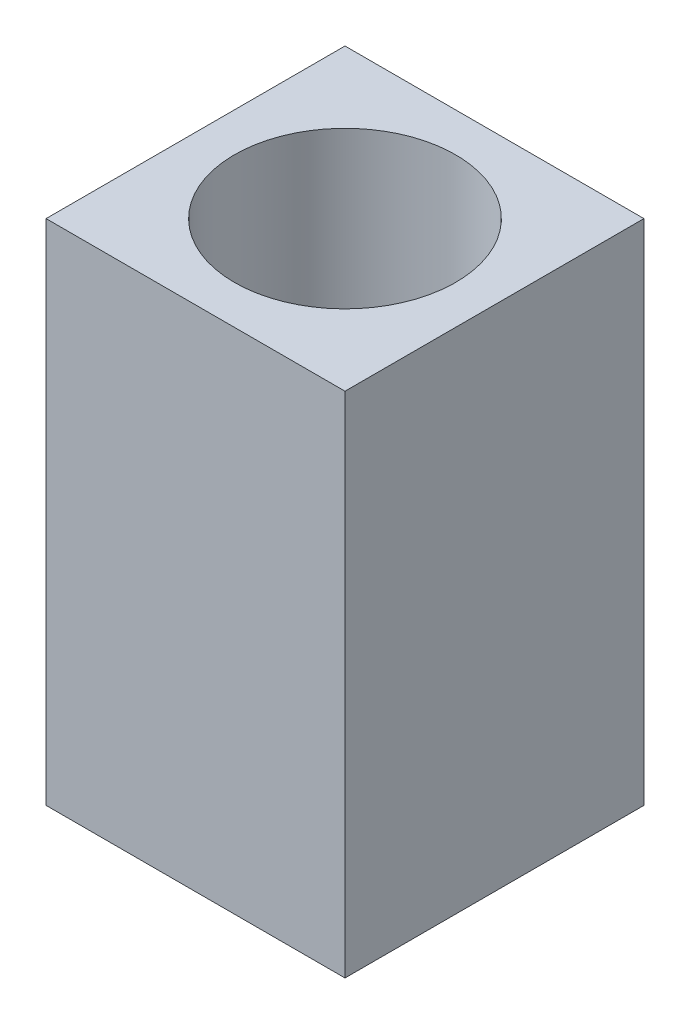
ISO-10303-21;
HEADER;
FILE_DESCRIPTION(('STEP AP214'),'2;1');
FILE_NAME('part.step','',(''),(''),'','','');
FILE_SCHEMA(('AUTOMOTIVE_DESIGN { 1 0 10303 214 1 1 1 1 }'));
ENDSEC;
DATA;
#1=APPLICATION_CONTEXT('core data for automotive mechanical design processes');
#2=APPLICATION_PROTOCOL_DEFINITION('international standard','automotive_design',2000,#1);
#3=PRODUCT_CONTEXT('',#1,'mechanical');
#4=PRODUCT('Part','Part','',(#3));
#5=PRODUCT_RELATED_PRODUCT_CATEGORY('part','',(#4));
#6=PRODUCT_DEFINITION_FORMATION('','',#4);
#7=PRODUCT_DEFINITION_CONTEXT('part definition',#1,'design');
#8=PRODUCT_DEFINITION('design','',#6,#7);
#9=PRODUCT_DEFINITION_SHAPE('','',#8);
#10=(LENGTH_UNIT() NAMED_UNIT(*) SI_UNIT(.MILLI.,.METRE.));
#11=(NAMED_UNIT(*) PLANE_ANGLE_UNIT() SI_UNIT($,.RADIAN.));
#12=(NAMED_UNIT(*) SI_UNIT($,.STERADIAN.) SOLID_ANGLE_UNIT());
#13=UNCERTAINTY_MEASURE_WITH_UNIT(LENGTH_MEASURE(1.E-05),#10,'distance_accuracy_value','');
#14=(GEOMETRIC_REPRESENTATION_CONTEXT(3) GLOBAL_UNCERTAINTY_ASSIGNED_CONTEXT((#13)) GLOBAL_UNIT_ASSIGNED_CONTEXT((#10,
#11,#12)) REPRESENTATION_CONTEXT('',''));
#15=CARTESIAN_POINT('',(0.,0.,0.));
#16=DIRECTION('',(0.,0.,1.));
#17=DIRECTION('',(1.,0.,0.));
#18=AXIS2_PLACEMENT_3D('',#15,#16,#17);
#19=CARTESIAN_POINT('',(0.,17.,0.));
#20=DIRECTION('',(0.,0.,-1.));
#21=DIRECTION('',(-1.,0.,0.));
#22=AXIS2_PLACEMENT_3D('',#19,#20,#21);
#23=PLANE('',#22);
#24=DIRECTION('',(1.,0.,0.));
#25=VECTOR('',#24,1.);
#26=CARTESIAN_POINT('',(0.,0.,0.));
#27=LINE('',#26,#25);
#28=CARTESIAN_POINT('',(0.,0.,0.));
#29=VERTEX_POINT('',#28);
#30=CARTESIAN_POINT('',(10.,0.,0.));
#31=VERTEX_POINT('',#30);
#32=EDGE_CURVE('E100',#29,#31,#27,.T.);
#33=ORIENTED_EDGE('',*,*,#32,.T.);
#34=DIRECTION('',(0.,-1.,0.));
#35=VECTOR('',#34,1.);
#36=CARTESIAN_POINT('',(10.,17.,0.));
#37=LINE('',#36,#35);
#38=CARTESIAN_POINT('',(10.,17.,0.));
#39=VERTEX_POINT('',#38);
#40=EDGE_CURVE('E11',#39,#31,#37,.T.);
#41=ORIENTED_EDGE('',*,*,#40,.F.);
#42=DIRECTION('',(1.,0.,0.));
#43=VECTOR('',#42,1.);
#44=CARTESIAN_POINT('',(0.,17.,0.));
#45=LINE('',#44,#43);
#46=CARTESIAN_POINT('',(0.,17.,0.));
#47=VERTEX_POINT('',#46);
#48=EDGE_CURVE('E88',#47,#39,#45,.T.);
#49=ORIENTED_EDGE('',*,*,#48,.F.);
#50=DIRECTION('',(0.,-1.,0.));
#51=VECTOR('',#50,1.);
#52=CARTESIAN_POINT('',(0.,17.,0.));
#53=LINE('',#52,#51);
#54=EDGE_CURVE('E96',#47,#29,#53,.T.);
#55=ORIENTED_EDGE('',*,*,#54,.T.);
#56=EDGE_LOOP('',(#33,#41,#49,#55));
#57=FACE_BOUND('',#56,.T.);
#58=ADVANCED_FACE('F37',(#57),#23,.F.);
#59=CARTESIAN_POINT('',(10.,17.,0.));
#60=DIRECTION('',(-1.,0.,0.));
#61=DIRECTION('',(0.,0.,1.));
#62=AXIS2_PLACEMENT_3D('',#59,#60,#61);
#63=PLANE('',#62);
#64=DIRECTION('',(0.,0.,-1.));
#65=VECTOR('',#64,1.);
#66=CARTESIAN_POINT('',(10.,0.,0.));
#67=LINE('',#66,#65);
#68=CARTESIAN_POINT('',(10.,0.,-10.));
#69=VERTEX_POINT('',#68);
#70=EDGE_CURVE('E92',#31,#69,#67,.T.);
#71=ORIENTED_EDGE('',*,*,#70,.T.);
#72=DIRECTION('',(0.,-1.,0.));
#73=VECTOR('',#72,1.);
#74=CARTESIAN_POINT('',(10.,17.,-10.));
#75=LINE('',#74,#73);
#76=CARTESIAN_POINT('',(10.,17.,-10.));
#77=VERTEX_POINT('',#76);
#78=EDGE_CURVE('E45',#77,#69,#75,.T.);
#79=ORIENTED_EDGE('',*,*,#78,.F.);
#80=DIRECTION('',(0.,0.,-1.));
#81=VECTOR('',#80,1.);
#82=CARTESIAN_POINT('',(10.,17.,0.));
#83=LINE('',#82,#81);
#84=EDGE_CURVE('E83',#39,#77,#83,.T.);
#85=ORIENTED_EDGE('',*,*,#84,.F.);
#86=ORIENTED_EDGE('',*,*,#40,.T.);
#87=EDGE_LOOP('',(#71,#79,#85,#86));
#88=FACE_BOUND('',#87,.T.);
#89=ADVANCED_FACE('F91',(#88),#63,.F.);
#90=CARTESIAN_POINT('',(0.,17.,-10.));
#91=DIRECTION('',(0.,0.,1.));
#92=DIRECTION('',(1.,0.,0.));
#93=AXIS2_PLACEMENT_3D('',#90,#91,#92);
#94=PLANE('',#93);
#95=DIRECTION('',(-1.,0.,0.));
#96=VECTOR('',#95,1.);
#97=CARTESIAN_POINT('',(0.,0.,-10.));
#98=LINE('',#97,#96);
#99=CARTESIAN_POINT('',(0.,0.,-10.));
#100=VERTEX_POINT('',#99);
#101=EDGE_CURVE('E70',#69,#100,#98,.T.);
#102=ORIENTED_EDGE('',*,*,#101,.T.);
#103=DIRECTION('',(0.,-1.,0.));
#104=VECTOR('',#103,1.);
#105=CARTESIAN_POINT('',(0.,17.,-10.));
#106=LINE('',#105,#104);
#107=CARTESIAN_POINT('',(0.,17.,-10.));
#108=VERTEX_POINT('',#107);
#109=EDGE_CURVE('E93',#108,#100,#106,.T.);
#110=ORIENTED_EDGE('',*,*,#109,.F.);
#111=DIRECTION('',(-1.,0.,0.));
#112=VECTOR('',#111,1.);
#113=CARTESIAN_POINT('',(0.,17.,-10.));
#114=LINE('',#113,#112);
#115=EDGE_CURVE('E86',#77,#108,#114,.T.);
#116=ORIENTED_EDGE('',*,*,#115,.F.);
#117=ORIENTED_EDGE('',*,*,#78,.T.);
#118=EDGE_LOOP('',(#102,#110,#116,#117));
#119=FACE_BOUND('',#118,.T.);
#120=ADVANCED_FACE('F94',(#119),#94,.F.);
#121=CARTESIAN_POINT('',(0.,17.,0.));
#122=DIRECTION('',(1.,0.,0.));
#123=DIRECTION('',(0.,0.,-1.));
#124=AXIS2_PLACEMENT_3D('',#121,#122,#123);
#125=PLANE('',#124);
#126=DIRECTION('',(0.,0.,1.));
#127=VECTOR('',#126,1.);
#128=CARTESIAN_POINT('',(0.,0.,0.));
#129=LINE('',#128,#127);
#130=EDGE_CURVE('E76',#100,#29,#129,.T.);
#131=ORIENTED_EDGE('',*,*,#130,.T.);
#132=ORIENTED_EDGE('',*,*,#54,.F.);
#133=DIRECTION('',(0.,0.,1.));
#134=VECTOR('',#133,1.);
#135=CARTESIAN_POINT('',(0.,17.,0.));
#136=LINE('',#135,#134);
#137=EDGE_CURVE('E53',#108,#47,#136,.T.);
#138=ORIENTED_EDGE('',*,*,#137,.F.);
#139=ORIENTED_EDGE('',*,*,#109,.T.);
#140=EDGE_LOOP('',(#131,#132,#138,#139));
#141=FACE_BOUND('',#140,.T.);
#142=ADVANCED_FACE('F108',(#141),#125,.F.);
#143=CARTESIAN_POINT('',(0.,17.,0.));
#144=DIRECTION('',(0.,1.,0.));
#145=DIRECTION('',(0.,0.,1.));
#146=AXIS2_PLACEMENT_3D('',#143,#144,#145);
#147=PLANE('',#146);
#148=CARTESIAN_POINT('',(5.,17.,-5.));
#149=DIRECTION('',(0.,1.,0.));
#150=DIRECTION('',(0.,0.,1.));
#151=AXIS2_PLACEMENT_3D('',#148,#149,#150);
#152=CIRCLE('',#151,3.7);
#153=CARTESIAN_POINT('',(5.,17.,-1.3));
#154=VERTEX_POINT('',#153);
#155=EDGE_CURVE('E114',#154,#154,#152,.T.);
#156=ORIENTED_EDGE('',*,*,#155,.F.);
#157=EDGE_LOOP('',(#156));
#158=FACE_BOUND('',#157,.T.);
#159=ORIENTED_EDGE('',*,*,#48,.T.);
#160=ORIENTED_EDGE('',*,*,#84,.T.);
#161=ORIENTED_EDGE('',*,*,#115,.T.);
#162=ORIENTED_EDGE('',*,*,#137,.T.);
#163=EDGE_LOOP('',(#159,#160,#161,#162));
#164=FACE_BOUND('',#163,.T.);
#165=ADVANCED_FACE('F84',(#158,#164),#147,.T.);
#166=CARTESIAN_POINT('',(0.,0.,0.));
#167=DIRECTION('',(0.,1.,0.));
#168=DIRECTION('',(0.,0.,1.));
#169=AXIS2_PLACEMENT_3D('',#166,#167,#168);
#170=PLANE('',#169);
#171=CARTESIAN_POINT('',(5.,0.,-5.));
#172=DIRECTION('',(0.,1.,0.));
#173=DIRECTION('',(0.,0.,1.));
#174=AXIS2_PLACEMENT_3D('',#171,#172,#173);
#175=CIRCLE('',#174,3.7);
#176=CARTESIAN_POINT('',(5.,0.,-1.3));
#177=VERTEX_POINT('',#176);
#178=EDGE_CURVE('E103',#177,#177,#175,.T.);
#179=ORIENTED_EDGE('',*,*,#178,.T.);
#180=EDGE_LOOP('',(#179));
#181=FACE_BOUND('',#180,.T.);
#182=ORIENTED_EDGE('',*,*,#32,.F.);
#183=ORIENTED_EDGE('',*,*,#130,.F.);
#184=ORIENTED_EDGE('',*,*,#101,.F.);
#185=ORIENTED_EDGE('',*,*,#70,.F.);
#186=EDGE_LOOP('',(#182,#183,#184,#185));
#187=FACE_BOUND('',#186,.T.);
#188=ADVANCED_FACE('F111',(#181,#187),#170,.F.);
#189=CARTESIAN_POINT('',(5.,0.,-5.));
#190=DIRECTION('',(0.,1.,0.));
#191=DIRECTION('',(0.,0.,1.));
#192=AXIS2_PLACEMENT_3D('',#189,#190,#191);
#193=CYLINDRICAL_SURFACE('',#192,3.7);
#194=ORIENTED_EDGE('',*,*,#178,.F.);
#195=EDGE_LOOP('',(#194));
#196=FACE_BOUND('',#195,.T.);
#197=ORIENTED_EDGE('',*,*,#155,.T.);
#198=EDGE_LOOP('',(#197));
#199=FACE_BOUND('',#198,.T.);
#200=ADVANCED_FACE('F121',(#196,#199),#193,.F.);
#201=CLOSED_SHELL('',(#58,#89,#120,#142,#165,#188,#200));
#202=MANIFOLD_SOLID_BREP('B2',#201);
#203=ADVANCED_BREP_SHAPE_REPRESENTATION('',(#18,#202),#14);
#204=SHAPE_DEFINITION_REPRESENTATION(#9,#203);
ENDSEC;
END-ISO-10303-21;
